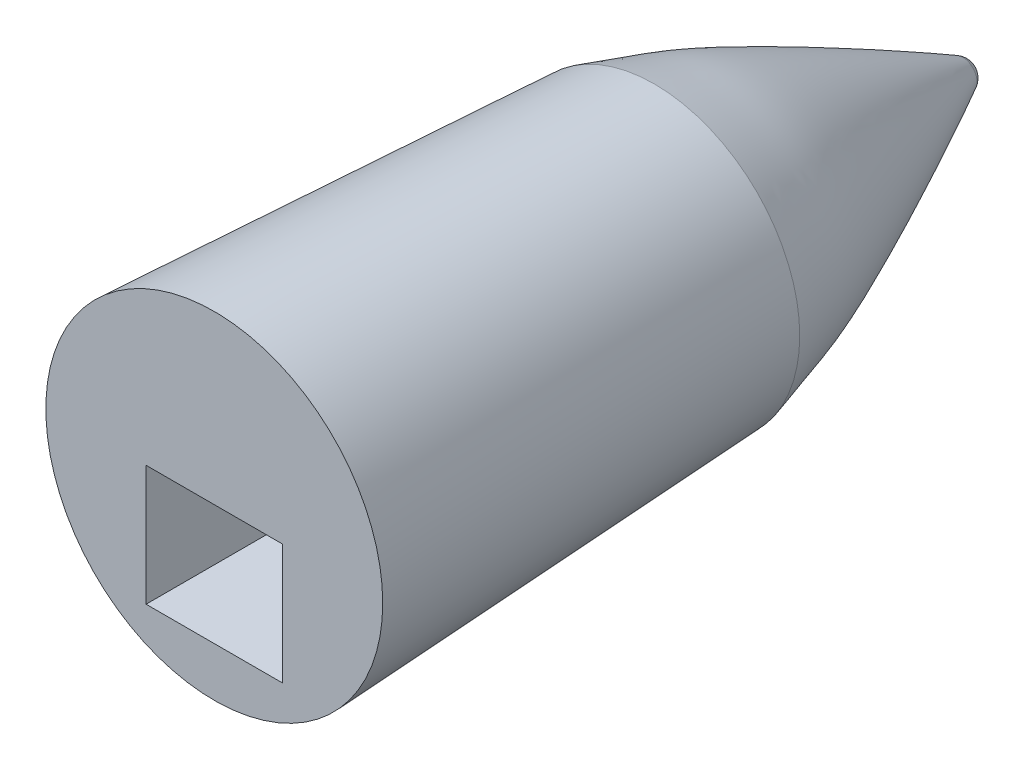
ISO-10303-21;
HEADER;
FILE_DESCRIPTION(('STEP AP214'),'2;1');
FILE_NAME('part.step','',(''),(''),'','','');
FILE_SCHEMA(('AUTOMOTIVE_DESIGN { 1 0 10303 214 1 1 1 1 }'));
ENDSEC;
DATA;
#1=APPLICATION_CONTEXT('core data for automotive mechanical design processes');
#2=APPLICATION_PROTOCOL_DEFINITION('international standard','automotive_design',2000,#1);
#3=PRODUCT_CONTEXT('',#1,'mechanical');
#4=PRODUCT('Part','Part','',(#3));
#5=PRODUCT_RELATED_PRODUCT_CATEGORY('part','',(#4));
#6=PRODUCT_DEFINITION_FORMATION('','',#4);
#7=PRODUCT_DEFINITION_CONTEXT('part definition',#1,'design');
#8=PRODUCT_DEFINITION('design','',#6,#7);
#9=PRODUCT_DEFINITION_SHAPE('','',#8);
#10=(LENGTH_UNIT() NAMED_UNIT(*) SI_UNIT(.MILLI.,.METRE.));
#11=(NAMED_UNIT(*) PLANE_ANGLE_UNIT() SI_UNIT($,.RADIAN.));
#12=(NAMED_UNIT(*) SI_UNIT($,.STERADIAN.) SOLID_ANGLE_UNIT());
#13=UNCERTAINTY_MEASURE_WITH_UNIT(LENGTH_MEASURE(1.E-05),#10,'distance_accuracy_value','');
#14=(GEOMETRIC_REPRESENTATION_CONTEXT(3) GLOBAL_UNCERTAINTY_ASSIGNED_CONTEXT((#13)) GLOBAL_UNIT_ASSIGNED_CONTEXT((#10,
#11,#12)) REPRESENTATION_CONTEXT('',''));
#15=CARTESIAN_POINT('',(0.,0.,0.));
#16=DIRECTION('',(0.,0.,1.));
#17=DIRECTION('',(1.,0.,0.));
#18=AXIS2_PLACEMENT_3D('',#15,#16,#17);
#19=CARTESIAN_POINT('',(8.5,0.136457205996657,-9.99999999999999));
#20=DIRECTION('',(0.,1.,0.));
#21=DIRECTION('',(-1.,0.,0.));
#22=AXIS2_PLACEMENT_3D('',#19,#20,#21);
#23=PLANE('',#22);
#24=DIRECTION('',(-1.,0.,0.));
#25=VECTOR('',#24,1.);
#26=CARTESIAN_POINT('',(8.5,0.136457205996657,2.00000000000001));
#27=LINE('',#26,#25);
#28=CARTESIAN_POINT('',(8.5,0.136457205996657,2.00000000000001));
#29=VERTEX_POINT('',#28);
#30=CARTESIAN_POINT('',(-8.5,0.136457205996653,2.00000000000001));
#31=VERTEX_POINT('',#30);
#32=EDGE_CURVE('E121',#29,#31,#27,.T.);
#33=ORIENTED_EDGE('',*,*,#32,.F.);
#34=DIRECTION('',(0.,0.,1.));
#35=VECTOR('',#34,1.);
#36=CARTESIAN_POINT('',(8.5,0.136457205996657,-9.99999999999999));
#37=LINE('',#36,#35);
#38=CARTESIAN_POINT('',(8.5,0.136457205996657,20.));
#39=VERTEX_POINT('',#38);
#40=EDGE_CURVE('E138',#29,#39,#37,.T.);
#41=ORIENTED_EDGE('',*,*,#40,.T.);
#42=DIRECTION('',(-1.,0.,0.));
#43=VECTOR('',#42,1.);
#44=CARTESIAN_POINT('',(8.5,0.136457205996657,20.));
#45=LINE('',#44,#43);
#46=CARTESIAN_POINT('',(-8.5,0.136457205996652,20.));
#47=VERTEX_POINT('',#46);
#48=EDGE_CURVE('E132',#39,#47,#45,.T.);
#49=ORIENTED_EDGE('',*,*,#48,.T.);
#50=DIRECTION('',(0.,0.,1.));
#51=VECTOR('',#50,1.);
#52=CARTESIAN_POINT('',(-8.5,0.136457205996652,-9.99999999999999));
#53=LINE('',#52,#51);
#54=EDGE_CURVE('E140',#31,#47,#53,.T.);
#55=ORIENTED_EDGE('',*,*,#54,.F.);
#56=EDGE_LOOP('',(#33,#41,#49,#55));
#57=FACE_BOUND('',#56,.T.);
#58=ADVANCED_FACE('F36',(#57),#23,.F.);
#59=CARTESIAN_POINT('',(-21.,0.,20.));
#60=DIRECTION('',(0.,0.,1.));
#61=DIRECTION('',(1.,0.,0.));
#62=AXIS2_PLACEMENT_3D('',#59,#60,#61);
#63=PLANE('',#62);
#64=CARTESIAN_POINT('',(0.,0.,20.));
#65=DIRECTION('',(0.,0.,1.));
#66=DIRECTION('',(1.,0.,0.));
#67=AXIS2_PLACEMENT_3D('',#64,#65,#66);
#68=CIRCLE('',#67,20.9999999999999);
#69=CARTESIAN_POINT('',(20.9999999999999,0.,20.));
#70=VERTEX_POINT('',#69);
#71=EDGE_CURVE('E47',#70,#70,#68,.T.);
#72=ORIENTED_EDGE('',*,*,#71,.T.);
#73=EDGE_LOOP('',(#72));
#74=FACE_BOUND('',#73,.T.);
#75=DIRECTION('',(0.,-1.,0.));
#76=VECTOR('',#75,1.);
#77=CARTESIAN_POINT('',(8.5,0.136457205996657,20.));
#78=LINE('',#77,#76);
#79=CARTESIAN_POINT('',(8.5,-14.8635427940033,20.));
#80=VERTEX_POINT('',#79);
#81=EDGE_CURVE('E125',#39,#80,#78,.T.);
#82=ORIENTED_EDGE('',*,*,#81,.T.);
#83=DIRECTION('',(-1.,0.,0.));
#84=VECTOR('',#83,1.);
#85=CARTESIAN_POINT('',(8.5,-14.8635427940033,20.));
#86=LINE('',#85,#84);
#87=CARTESIAN_POINT('',(-8.5,-14.8635427940033,20.));
#88=VERTEX_POINT('',#87);
#89=EDGE_CURVE('E123',#80,#88,#86,.T.);
#90=ORIENTED_EDGE('',*,*,#89,.T.);
#91=DIRECTION('',(0.,-1.,0.));
#92=VECTOR('',#91,1.);
#93=CARTESIAN_POINT('',(-8.5,0.136457205996652,20.));
#94=LINE('',#93,#92);
#95=EDGE_CURVE('E129',#47,#88,#94,.T.);
#96=ORIENTED_EDGE('',*,*,#95,.F.);
#97=ORIENTED_EDGE('',*,*,#48,.F.);
#98=EDGE_LOOP('',(#82,#90,#96,#97));
#99=FACE_BOUND('',#98,.T.);
#100=ADVANCED_FACE('F150',(#74,#99),#63,.T.);
#101=CARTESIAN_POINT('',(1.18232888729888,0.,-78.386897894658));
#102=CARTESIAN_POINT('',(1.1448682870155,0.,-78.337537995573));
#103=CARTESIAN_POINT('',(1.08134637621627,0.,-78.2501250041484));
#104=CARTESIAN_POINT('',(0.887069136221639,0.,-77.9670361500811));
#105=CARTESIAN_POINT('',(0.591669742382043,0.,-77.5048440137872));
#106=CARTESIAN_POINT('',(0.157166302512492,0.,-76.7834785140635));
#107=CARTESIAN_POINT('',(-0.507504384666931,0.,-75.632564394992));
#108=CARTESIAN_POINT('',(-1.47993800360203,0.,-73.8732493620974));
#109=CARTESIAN_POINT('',(-2.81904038998341,0.,-71.3511119580099));
#110=CARTESIAN_POINT('',(-4.28317178062338,0.,-68.5096952638203));
#111=CARTESIAN_POINT('',(-6.34049430938925,0.,-64.4155304953748));
#112=CARTESIAN_POINT('',(-8.99662602090634,0.,-58.9452399370969));
#113=CARTESIAN_POINT('',(-11.9550466861516,0.,-52.5311799018783));
#114=CARTESIAN_POINT('',(-13.9372281625268,0.,-47.8862095161671));
#115=CARTESIAN_POINT('',(-15.0241639350782,0.,-45.0123803284205));
#116=CARTESIAN_POINT('',(-15.6355384490276,0.,-43.1975890317264));
#117=CARTESIAN_POINT('',(-16.1399953178683,0.,-41.546015667143));
#118=CARTESIAN_POINT('',(-16.7941111827417,0.,-39.3247757148786));
#119=CARTESIAN_POINT('',(-17.6838039165856,0.,-36.3876946855298));
#120=CARTESIAN_POINT('',(-18.7810076484271,0.,-32.6183093931523));
#121=CARTESIAN_POINT('',(-19.8618052911475,0.,-28.5429805850924));
#122=CARTESIAN_POINT('',(-20.869841961325,0.,-24.1215405855657));
#123=CARTESIAN_POINT('',(-21.7511525773498,0.,-19.3089534223026));
#124=CARTESIAN_POINT('',(-22.3338291286441,0.,-14.9367043755645));
#125=CARTESIAN_POINT('',(-22.6809313402681,0.,-11.1998995244367));
#126=CARTESIAN_POINT('',(-22.8746511496842,0.,-8.27342327266497));
#127=CARTESIAN_POINT('',(-22.9746433491475,0.,-5.72379418255314));
#128=CARTESIAN_POINT('',(-23.0142011421297,0.,-3.62223137132021));
#129=CARTESIAN_POINT('',(-23.0198829991225,0.,-2.53795958133577));
#130=CARTESIAN_POINT('',(-23.0190686720116,0.,-1.99999999999999));
#131=B_SPLINE_CURVE_WITH_KNOTS('',3,(#101,#102,#103,#104,#105,#106,#107,#108,#109,#110,#111,
#112,#113,#114,#115,#116,#117,#118,#119,#120,#121,#122,#123,#124,#125,#126,#127,#128,#129,#130),
.UNSPECIFIED.,.F.,.F.,(4,1,1,1,1,1,1,1,1,1,1,1,1,1,1,1,1,1,1,1,1,1,1,1,1,1,1,4),
(0.0177016813458629,0.0251442890708695,0.032586896795876,0.047472112245889,0.0623573276959021,
0.0772425431459152,0.107012974045941,0.136783404945967,0.166553835845993,0.196324266746019,
0.255865128546072,0.315405990346124,0.374946852146176,0.404717283046202,0.434487713946228,
0.464258144846254,0.49402857574628,0.553569437546332,0.613110299346384,0.672651161146437,
0.732192022946489,0.791732884746541,0.851273746546593,0.881044177446619,0.910814608346645,
0.940585039246671,0.955470254696684,0.970355470146697),.UNSPECIFIED.);
#132=CARTESIAN_POINT('',(0.,0.,-76.5094565907727));
#133=DIRECTION('',(0.,0.,-1.));
#134=AXIS1_PLACEMENT('',#132,#133);
#135=SURFACE_OF_REVOLUTION('',#131,#134);
#136=CARTESIAN_POINT('',(0.,0.,-34.8639931183328));
#137=DIRECTION('',(0.,0.,-1.));
#138=DIRECTION('',(-1.,0.,0.));
#139=AXIS2_PLACEMENT_3D('',#136,#137,#138);
#140=CIRCLE('',#139,18.124699958068);
#141=CARTESIAN_POINT('',(-18.124699958068,0.,-34.8639931183328));
#142=VERTEX_POINT('',#141);
#143=EDGE_CURVE('E11',#142,#142,#140,.F.);
#144=ORIENTED_EDGE('',*,*,#143,.F.);
#145=EDGE_LOOP('',(#144));
#146=FACE_BOUND('',#145,.T.);
#147=CARTESIAN_POINT('',(9.64539660563083E-09,0.,-73.3340621665054));
#148=DIRECTION('',(0.,0.,-1.));
#149=DIRECTION('',(-1.,0.,0.));
#150=AXIS2_PLACEMENT_3D('',#147,#148,#149);
#151=CIRCLE('',#150,1.76222381539992);
#152=CARTESIAN_POINT('',(-1.76222380575453,0.,-73.3340621665054));
#153=VERTEX_POINT('',#152);
#154=EDGE_CURVE('E144',#153,#153,#151,.T.);
#155=ORIENTED_EDGE('',*,*,#154,.F.);
#156=EDGE_LOOP('',(#155));
#157=FACE_BOUND('',#156,.T.);
#158=ADVANCED_FACE('F38',(#146,#157),#135,.F.);
#159=CARTESIAN_POINT('',(0.,0.,-66.9719738211416));
#160=DIRECTION('',(0.,0.,1.));
#161=DIRECTION('',(1.,0.,0.));
#162=AXIS2_PLACEMENT_3D('',#159,#160,#161);
#163=CONICAL_SURFACE('',#162,16.4419919921711,0.0523598775598305);
#164=ORIENTED_EDGE('',*,*,#143,.T.);
#165=EDGE_LOOP('',(#164));
#166=FACE_BOUND('',#165,.T.);
#167=ORIENTED_EDGE('',*,*,#71,.F.);
#168=EDGE_LOOP('',(#167));
#169=FACE_BOUND('',#168,.T.);
#170=ADVANCED_FACE('F153',(#166,#169),#163,.T.);
#171=CARTESIAN_POINT('',(9.64539647653048E-09,0.,-72.3882465447045));
#172=DIRECTION('',(0.,0.,-1.));
#173=DIRECTION('',(1.,0.,0.));
#174=AXIS2_PLACEMENT_3D('',#171,#172,#173);
#175=SPHERICAL_SURFACE('',#174,1.99999999150133);
#176=ORIENTED_EDGE('',*,*,#154,.T.);
#177=EDGE_LOOP('',(#176));
#178=FACE_BOUND('',#177,.T.);
#179=ADVANCED_FACE('F155',(#178),#175,.T.);
#180=CARTESIAN_POINT('',(8.5,-14.8635427940033,-9.99999999999999));
#181=DIRECTION('',(0.,1.,0.));
#182=DIRECTION('',(-1.,0.,0.));
#183=AXIS2_PLACEMENT_3D('',#180,#181,#182);
#184=PLANE('',#183);
#185=DIRECTION('',(0.,0.,1.));
#186=VECTOR('',#185,1.);
#187=CARTESIAN_POINT('',(-8.5,-14.8635427940033,-9.99999999999999));
#188=LINE('',#187,#186);
#189=CARTESIAN_POINT('',(-8.5,-14.8635427940033,-9.99999999999999));
#190=VERTEX_POINT('',#189);
#191=EDGE_CURVE('E142',#190,#88,#188,.T.);
#192=ORIENTED_EDGE('',*,*,#191,.T.);
#193=ORIENTED_EDGE('',*,*,#89,.F.);
#194=DIRECTION('',(0.,0.,1.));
#195=VECTOR('',#194,1.);
#196=CARTESIAN_POINT('',(8.5,-14.8635427940033,-9.99999999999999));
#197=LINE('',#196,#195);
#198=CARTESIAN_POINT('',(8.5,-14.8635427940033,-9.99999999999999));
#199=VERTEX_POINT('',#198);
#200=EDGE_CURVE('E62',#199,#80,#197,.T.);
#201=ORIENTED_EDGE('',*,*,#200,.F.);
#202=DIRECTION('',(-1.,0.,0.));
#203=VECTOR('',#202,1.);
#204=CARTESIAN_POINT('',(8.5,-14.8635427940033,-9.99999999999999));
#205=LINE('',#204,#203);
#206=EDGE_CURVE('E99',#199,#190,#205,.T.);
#207=ORIENTED_EDGE('',*,*,#206,.T.);
#208=EDGE_LOOP('',(#192,#193,#201,#207));
#209=FACE_BOUND('',#208,.T.);
#210=ADVANCED_FACE('F162',(#209),#184,.T.);
#211=CARTESIAN_POINT('',(-8.5,0.136457205996652,-9.99999999999999));
#212=DIRECTION('',(-1.,0.,0.));
#213=DIRECTION('',(0.,0.,1.));
#214=AXIS2_PLACEMENT_3D('',#211,#212,#213);
#215=PLANE('',#214);
#216=DIRECTION('',(0.,-1.,0.));
#217=VECTOR('',#216,1.);
#218=CARTESIAN_POINT('',(-8.5,0.136457205996652,-9.99999999999999));
#219=LINE('',#218,#217);
#220=CARTESIAN_POINT('',(-8.50000000000001,10.1364572059967,-9.99999999999999));
#221=VERTEX_POINT('',#220);
#222=EDGE_CURVE('E101',#221,#190,#219,.T.);
#223=ORIENTED_EDGE('',*,*,#222,.F.);
#224=DIRECTION('',(0.,0.,1.));
#225=VECTOR('',#224,1.);
#226=CARTESIAN_POINT('',(-8.50000000000001,10.1364572059967,-9.99999999999999));
#227=LINE('',#226,#225);
#228=CARTESIAN_POINT('',(-8.50000000000001,10.1364572059967,2.00000000000001));
#229=VERTEX_POINT('',#228);
#230=EDGE_CURVE('E108',#221,#229,#227,.T.);
#231=ORIENTED_EDGE('',*,*,#230,.T.);
#232=DIRECTION('',(0.,-1.,0.));
#233=VECTOR('',#232,1.);
#234=CARTESIAN_POINT('',(-8.50000000000001,10.1364572059967,2.00000000000001));
#235=LINE('',#234,#233);
#236=EDGE_CURVE('E118',#229,#31,#235,.T.);
#237=ORIENTED_EDGE('',*,*,#236,.T.);
#238=ORIENTED_EDGE('',*,*,#54,.T.);
#239=ORIENTED_EDGE('',*,*,#95,.T.);
#240=ORIENTED_EDGE('',*,*,#191,.F.);
#241=EDGE_LOOP('',(#223,#231,#237,#238,#239,#240));
#242=FACE_BOUND('',#241,.T.);
#243=ADVANCED_FACE('F177',(#242),#215,.F.);
#244=CARTESIAN_POINT('',(8.5,0.136457205996657,-9.99999999999999));
#245=DIRECTION('',(-1.,0.,0.));
#246=DIRECTION('',(0.,-1.,0.));
#247=AXIS2_PLACEMENT_3D('',#244,#245,#246);
#248=PLANE('',#247);
#249=ORIENTED_EDGE('',*,*,#200,.T.);
#250=ORIENTED_EDGE('',*,*,#81,.F.);
#251=ORIENTED_EDGE('',*,*,#40,.F.);
#252=DIRECTION('',(0.,-1.,0.));
#253=VECTOR('',#252,1.);
#254=CARTESIAN_POINT('',(8.49999999999999,10.1364572059967,2.00000000000001));
#255=LINE('',#254,#253);
#256=CARTESIAN_POINT('',(8.49999999999999,10.1364572059967,2.00000000000001));
#257=VERTEX_POINT('',#256);
#258=EDGE_CURVE('E54',#257,#29,#255,.T.);
#259=ORIENTED_EDGE('',*,*,#258,.F.);
#260=DIRECTION('',(0.,0.,-1.));
#261=VECTOR('',#260,1.);
#262=CARTESIAN_POINT('',(8.49999999999999,10.1364572059967,-9.99999999999999));
#263=LINE('',#262,#261);
#264=CARTESIAN_POINT('',(8.49999999999999,10.1364572059967,-9.99999999999999));
#265=VERTEX_POINT('',#264);
#266=EDGE_CURVE('E107',#257,#265,#263,.T.);
#267=ORIENTED_EDGE('',*,*,#266,.T.);
#268=DIRECTION('',(0.,-1.,0.));
#269=VECTOR('',#268,1.);
#270=CARTESIAN_POINT('',(8.5,0.136457205996657,-9.99999999999999));
#271=LINE('',#270,#269);
#272=EDGE_CURVE('E93',#265,#199,#271,.T.);
#273=ORIENTED_EDGE('',*,*,#272,.T.);
#274=EDGE_LOOP('',(#249,#250,#251,#259,#267,#273));
#275=FACE_BOUND('',#274,.T.);
#276=ADVANCED_FACE('F110',(#275),#248,.T.);
#277=CARTESIAN_POINT('',(0.,0.,-9.99999999999999));
#278=DIRECTION('',(0.,0.,1.));
#279=DIRECTION('',(1.,0.,0.));
#280=AXIS2_PLACEMENT_3D('',#277,#278,#279);
#281=PLANE('',#280);
#282=ORIENTED_EDGE('',*,*,#206,.F.);
#283=ORIENTED_EDGE('',*,*,#272,.F.);
#284=DIRECTION('',(-1.,0.,0.));
#285=VECTOR('',#284,1.);
#286=CARTESIAN_POINT('',(8.49999999999999,10.1364572059967,-9.99999999999999));
#287=LINE('',#286,#285);
#288=EDGE_CURVE('E97',#265,#221,#287,.T.);
#289=ORIENTED_EDGE('',*,*,#288,.T.);
#290=ORIENTED_EDGE('',*,*,#222,.T.);
#291=EDGE_LOOP('',(#282,#283,#289,#290));
#292=FACE_BOUND('',#291,.T.);
#293=ADVANCED_FACE('F95',(#292),#281,.T.);
#294=CARTESIAN_POINT('',(8.49999999999999,10.1364572059967,2.00000000000001));
#295=DIRECTION('',(0.,0.,-1.));
#296=DIRECTION('',(-1.,0.,0.));
#297=AXIS2_PLACEMENT_3D('',#294,#295,#296);
#298=PLANE('',#297);
#299=ORIENTED_EDGE('',*,*,#32,.T.);
#300=ORIENTED_EDGE('',*,*,#236,.F.);
#301=DIRECTION('',(1.,0.,0.));
#302=VECTOR('',#301,1.);
#303=CARTESIAN_POINT('',(8.49999999999999,10.1364572059967,2.00000000000001));
#304=LINE('',#303,#302);
#305=EDGE_CURVE('E115',#229,#257,#304,.T.);
#306=ORIENTED_EDGE('',*,*,#305,.T.);
#307=ORIENTED_EDGE('',*,*,#258,.T.);
#308=EDGE_LOOP('',(#299,#300,#306,#307));
#309=FACE_BOUND('',#308,.T.);
#310=ADVANCED_FACE('F189',(#309),#298,.T.);
#311=CARTESIAN_POINT('',(0.,10.1364572059967,0.));
#312=DIRECTION('',(0.,-1.,0.));
#313=DIRECTION('',(1.,0.,0.));
#314=AXIS2_PLACEMENT_3D('',#311,#312,#313);
#315=PLANE('',#314);
#316=ORIENTED_EDGE('',*,*,#266,.F.);
#317=ORIENTED_EDGE('',*,*,#305,.F.);
#318=ORIENTED_EDGE('',*,*,#230,.F.);
#319=ORIENTED_EDGE('',*,*,#288,.F.);
#320=EDGE_LOOP('',(#316,#317,#318,#319));
#321=FACE_BOUND('',#320,.T.);
#322=ADVANCED_FACE('F105',(#321),#315,.T.);
#323=CLOSED_SHELL('',(#58,#100,#158,#170,#179,#210,#243,#276,#293,#310,#322));
#324=MANIFOLD_SOLID_BREP('B2',#323);
#325=ADVANCED_BREP_SHAPE_REPRESENTATION('',(#18,#324),#14);
#326=SHAPE_DEFINITION_REPRESENTATION(#9,#325);
ENDSEC;
END-ISO-10303-21;
